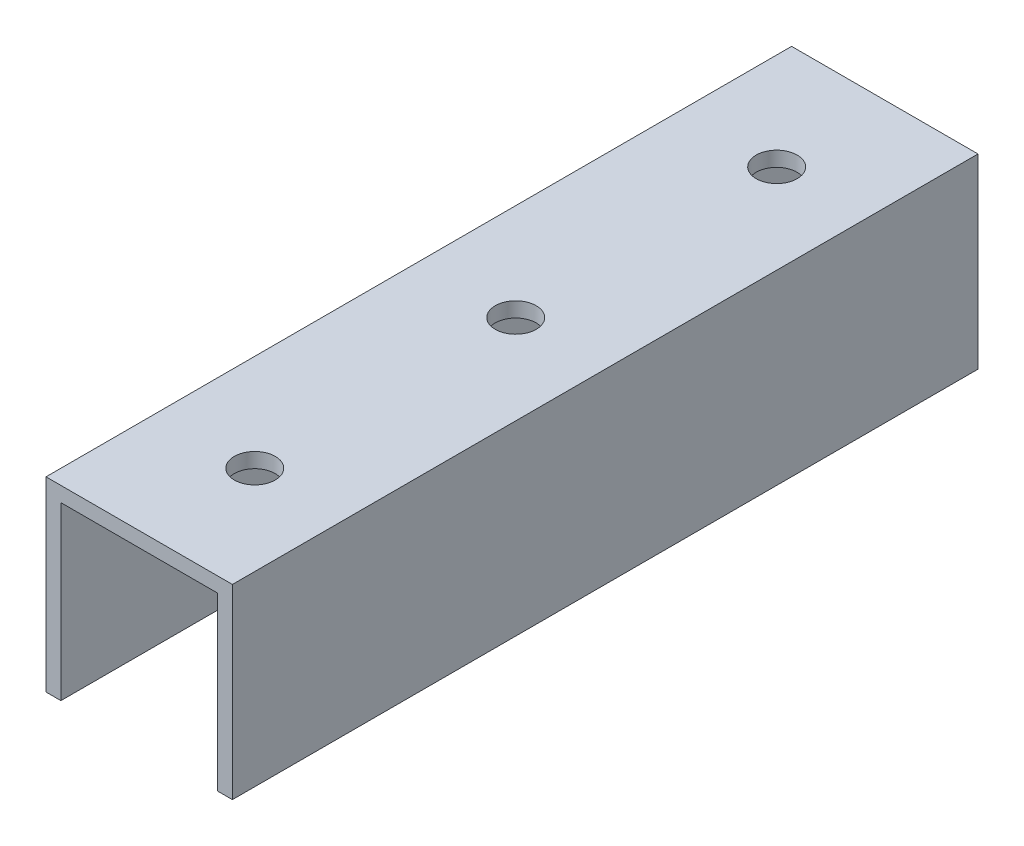
ISO-10303-21;
HEADER;
FILE_DESCRIPTION(('STEP AP214'),'2;1');
FILE_NAME('part.step','',(''),(''),'','','');
FILE_SCHEMA(('AUTOMOTIVE_DESIGN { 1 0 10303 214 1 1 1 1 }'));
ENDSEC;
DATA;
#1=APPLICATION_CONTEXT('core data for automotive mechanical design processes');
#2=APPLICATION_PROTOCOL_DEFINITION('international standard','automotive_design',2000,#1);
#3=PRODUCT_CONTEXT('',#1,'mechanical');
#4=PRODUCT('Part','Part','',(#3));
#5=PRODUCT_RELATED_PRODUCT_CATEGORY('part','',(#4));
#6=PRODUCT_DEFINITION_FORMATION('','',#4);
#7=PRODUCT_DEFINITION_CONTEXT('part definition',#1,'design');
#8=PRODUCT_DEFINITION('design','',#6,#7);
#9=PRODUCT_DEFINITION_SHAPE('','',#8);
#10=(LENGTH_UNIT() NAMED_UNIT(*) SI_UNIT(.MILLI.,.METRE.));
#11=(NAMED_UNIT(*) PLANE_ANGLE_UNIT() SI_UNIT($,.RADIAN.));
#12=(NAMED_UNIT(*) SI_UNIT($,.STERADIAN.) SOLID_ANGLE_UNIT());
#13=UNCERTAINTY_MEASURE_WITH_UNIT(LENGTH_MEASURE(1.E-05),#10,'distance_accuracy_value','');
#14=(GEOMETRIC_REPRESENTATION_CONTEXT(3) GLOBAL_UNCERTAINTY_ASSIGNED_CONTEXT((#13)) GLOBAL_UNIT_ASSIGNED_CONTEXT((#10,
#11,#12)) REPRESENTATION_CONTEXT('',''));
#15=CARTESIAN_POINT('',(0.,0.,0.));
#16=DIRECTION('',(0.,0.,1.));
#17=DIRECTION('',(1.,0.,0.));
#18=AXIS2_PLACEMENT_3D('',#15,#16,#17);
#19=CARTESIAN_POINT('',(2.,0.,100.));
#20=DIRECTION('',(0.,1.,0.));
#21=DIRECTION('',(-1.,0.,0.));
#22=AXIS2_PLACEMENT_3D('',#19,#20,#21);
#23=PLANE('',#22);
#24=DIRECTION('',(1.,0.,0.));
#25=VECTOR('',#24,1.);
#26=CARTESIAN_POINT('',(2.,0.,0.));
#27=LINE('',#26,#25);
#28=CARTESIAN_POINT('',(0.,0.,0.));
#29=VERTEX_POINT('',#28);
#30=CARTESIAN_POINT('',(2.,0.,0.));
#31=VERTEX_POINT('',#30);
#32=EDGE_CURVE('E130',#29,#31,#27,.T.);
#33=ORIENTED_EDGE('',*,*,#32,.T.);
#34=DIRECTION('',(0.,0.,-1.));
#35=VECTOR('',#34,1.);
#36=CARTESIAN_POINT('',(2.,0.,100.));
#37=LINE('',#36,#35);
#38=CARTESIAN_POINT('',(2.,0.,100.));
#39=VERTEX_POINT('',#38);
#40=EDGE_CURVE('E11',#39,#31,#37,.T.);
#41=ORIENTED_EDGE('',*,*,#40,.F.);
#42=DIRECTION('',(1.,0.,0.));
#43=VECTOR('',#42,1.);
#44=CARTESIAN_POINT('',(2.,0.,100.));
#45=LINE('',#44,#43);
#46=CARTESIAN_POINT('',(0.,0.,100.));
#47=VERTEX_POINT('',#46);
#48=EDGE_CURVE('E145',#47,#39,#45,.T.);
#49=ORIENTED_EDGE('',*,*,#48,.F.);
#50=DIRECTION('',(0.,0.,-1.));
#51=VECTOR('',#50,1.);
#52=CARTESIAN_POINT('',(0.,0.,100.));
#53=LINE('',#52,#51);
#54=EDGE_CURVE('E126',#47,#29,#53,.T.);
#55=ORIENTED_EDGE('',*,*,#54,.T.);
#56=EDGE_LOOP('',(#33,#41,#49,#55));
#57=FACE_BOUND('',#56,.T.);
#58=ADVANCED_FACE('F34',(#57),#23,.F.);
#59=CARTESIAN_POINT('',(2.,23.,100.));
#60=DIRECTION('',(-1.,0.,0.));
#61=DIRECTION('',(0.,-1.,0.));
#62=AXIS2_PLACEMENT_3D('',#59,#60,#61);
#63=PLANE('',#62);
#64=DIRECTION('',(0.,1.,0.));
#65=VECTOR('',#64,1.);
#66=CARTESIAN_POINT('',(2.,23.,0.));
#67=LINE('',#66,#65);
#68=CARTESIAN_POINT('',(2.,23.,0.));
#69=VERTEX_POINT('',#68);
#70=EDGE_CURVE('E133',#31,#69,#67,.T.);
#71=ORIENTED_EDGE('',*,*,#70,.T.);
#72=DIRECTION('',(0.,0.,-1.));
#73=VECTOR('',#72,1.);
#74=CARTESIAN_POINT('',(2.,23.,100.));
#75=LINE('',#74,#73);
#76=CARTESIAN_POINT('',(2.,23.,100.));
#77=VERTEX_POINT('',#76);
#78=EDGE_CURVE('E42',#77,#69,#75,.T.);
#79=ORIENTED_EDGE('',*,*,#78,.F.);
#80=DIRECTION('',(0.,1.,0.));
#81=VECTOR('',#80,1.);
#82=CARTESIAN_POINT('',(2.,23.,100.));
#83=LINE('',#82,#81);
#84=EDGE_CURVE('E93',#39,#77,#83,.T.);
#85=ORIENTED_EDGE('',*,*,#84,.F.);
#86=ORIENTED_EDGE('',*,*,#40,.T.);
#87=EDGE_LOOP('',(#71,#79,#85,#86));
#88=FACE_BOUND('',#87,.T.);
#89=ADVANCED_FACE('F215',(#88),#63,.F.);
#90=CARTESIAN_POINT('',(23.,23.,100.));
#91=DIRECTION('',(0.,1.,0.));
#92=DIRECTION('',(-1.,0.,0.));
#93=AXIS2_PLACEMENT_3D('',#90,#91,#92);
#94=PLANE('',#93);
#95=CARTESIAN_POINT('',(13.,23.,50.));
#96=DIRECTION('',(0.,1.,0.));
#97=DIRECTION('',(-1.,0.,0.));
#98=AXIS2_PLACEMENT_3D('',#95,#96,#97);
#99=CIRCLE('',#98,2.74999999999999);
#100=CARTESIAN_POINT('',(10.25,23.,50.));
#101=VERTEX_POINT('',#100);
#102=EDGE_CURVE('E189',#101,#101,#99,.T.);
#103=ORIENTED_EDGE('',*,*,#102,.T.);
#104=EDGE_LOOP('',(#103));
#105=FACE_BOUND('',#104,.T.);
#106=CARTESIAN_POINT('',(13.,23.,15.));
#107=DIRECTION('',(0.,1.,0.));
#108=DIRECTION('',(-1.,0.,0.));
#109=AXIS2_PLACEMENT_3D('',#106,#107,#108);
#110=CIRCLE('',#109,2.74999999999999);
#111=CARTESIAN_POINT('',(10.25,23.,15.));
#112=VERTEX_POINT('',#111);
#113=EDGE_CURVE('E183',#112,#112,#110,.T.);
#114=ORIENTED_EDGE('',*,*,#113,.T.);
#115=EDGE_LOOP('',(#114));
#116=FACE_BOUND('',#115,.T.);
#117=CARTESIAN_POINT('',(13.,23.,85.));
#118=DIRECTION('',(0.,1.,0.));
#119=DIRECTION('',(-1.,0.,0.));
#120=AXIS2_PLACEMENT_3D('',#117,#118,#119);
#121=CIRCLE('',#120,2.74999999999999);
#122=CARTESIAN_POINT('',(10.25,23.,85.));
#123=VERTEX_POINT('',#122);
#124=EDGE_CURVE('E134',#123,#123,#121,.T.);
#125=ORIENTED_EDGE('',*,*,#124,.T.);
#126=EDGE_LOOP('',(#125));
#127=FACE_BOUND('',#126,.T.);
#128=DIRECTION('',(1.,0.,0.));
#129=VECTOR('',#128,1.);
#130=CARTESIAN_POINT('',(23.,23.,0.));
#131=LINE('',#130,#129);
#132=CARTESIAN_POINT('',(23.,23.,0.));
#133=VERTEX_POINT('',#132);
#134=EDGE_CURVE('E136',#69,#133,#131,.T.);
#135=ORIENTED_EDGE('',*,*,#134,.T.);
#136=DIRECTION('',(0.,0.,-1.));
#137=VECTOR('',#136,1.);
#138=CARTESIAN_POINT('',(23.,23.,100.));
#139=LINE('',#138,#137);
#140=CARTESIAN_POINT('',(23.,23.,100.));
#141=VERTEX_POINT('',#140);
#142=EDGE_CURVE('E152',#141,#133,#139,.T.);
#143=ORIENTED_EDGE('',*,*,#142,.F.);
#144=DIRECTION('',(1.,0.,0.));
#145=VECTOR('',#144,1.);
#146=CARTESIAN_POINT('',(23.,23.,100.));
#147=LINE('',#146,#145);
#148=EDGE_CURVE('E160',#77,#141,#147,.T.);
#149=ORIENTED_EDGE('',*,*,#148,.F.);
#150=ORIENTED_EDGE('',*,*,#78,.T.);
#151=EDGE_LOOP('',(#135,#143,#149,#150));
#152=FACE_BOUND('',#151,.T.);
#153=ADVANCED_FACE('F158',(#105,#116,#127,#152),#94,.F.);
#154=CARTESIAN_POINT('',(23.,0.,100.));
#155=DIRECTION('',(1.,0.,0.));
#156=DIRECTION('',(0.,0.,-1.));
#157=AXIS2_PLACEMENT_3D('',#154,#155,#156);
#158=PLANE('',#157);
#159=DIRECTION('',(0.,-1.,0.));
#160=VECTOR('',#159,1.);
#161=CARTESIAN_POINT('',(23.,0.,0.));
#162=LINE('',#161,#160);
#163=CARTESIAN_POINT('',(23.,0.,0.));
#164=VERTEX_POINT('',#163);
#165=EDGE_CURVE('E138',#133,#164,#162,.T.);
#166=ORIENTED_EDGE('',*,*,#165,.T.);
#167=DIRECTION('',(0.,0.,-1.));
#168=VECTOR('',#167,1.);
#169=CARTESIAN_POINT('',(23.,0.,100.));
#170=LINE('',#169,#168);
#171=CARTESIAN_POINT('',(23.,0.,100.));
#172=VERTEX_POINT('',#171);
#173=EDGE_CURVE('E149',#172,#164,#170,.T.);
#174=ORIENTED_EDGE('',*,*,#173,.F.);
#175=DIRECTION('',(0.,-1.,0.));
#176=VECTOR('',#175,1.);
#177=CARTESIAN_POINT('',(23.,0.,100.));
#178=LINE('',#177,#176);
#179=EDGE_CURVE('E172',#141,#172,#178,.T.);
#180=ORIENTED_EDGE('',*,*,#179,.F.);
#181=ORIENTED_EDGE('',*,*,#142,.T.);
#182=EDGE_LOOP('',(#166,#174,#180,#181));
#183=FACE_BOUND('',#182,.T.);
#184=ADVANCED_FACE('F168',(#183),#158,.F.);
#185=CARTESIAN_POINT('',(25.,0.,100.));
#186=DIRECTION('',(0.,1.,0.));
#187=DIRECTION('',(-1.,0.,0.));
#188=AXIS2_PLACEMENT_3D('',#185,#186,#187);
#189=PLANE('',#188);
#190=DIRECTION('',(1.,0.,0.));
#191=VECTOR('',#190,1.);
#192=CARTESIAN_POINT('',(25.,0.,0.));
#193=LINE('',#192,#191);
#194=CARTESIAN_POINT('',(25.,0.,0.));
#195=VERTEX_POINT('',#194);
#196=EDGE_CURVE('E140',#164,#195,#193,.T.);
#197=ORIENTED_EDGE('',*,*,#196,.T.);
#198=DIRECTION('',(0.,0.,-1.));
#199=VECTOR('',#198,1.);
#200=CARTESIAN_POINT('',(25.,0.,100.));
#201=LINE('',#200,#199);
#202=CARTESIAN_POINT('',(25.,0.,100.));
#203=VERTEX_POINT('',#202);
#204=EDGE_CURVE('E121',#203,#195,#201,.T.);
#205=ORIENTED_EDGE('',*,*,#204,.F.);
#206=DIRECTION('',(1.,0.,0.));
#207=VECTOR('',#206,1.);
#208=CARTESIAN_POINT('',(25.,0.,100.));
#209=LINE('',#208,#207);
#210=EDGE_CURVE('E112',#172,#203,#209,.T.);
#211=ORIENTED_EDGE('',*,*,#210,.F.);
#212=ORIENTED_EDGE('',*,*,#173,.T.);
#213=EDGE_LOOP('',(#197,#205,#211,#212));
#214=FACE_BOUND('',#213,.T.);
#215=ADVANCED_FACE('F171',(#214),#189,.F.);
#216=CARTESIAN_POINT('',(25.,25.,100.));
#217=DIRECTION('',(-1.,0.,0.));
#218=DIRECTION('',(0.,-1.,0.));
#219=AXIS2_PLACEMENT_3D('',#216,#217,#218);
#220=PLANE('',#219);
#221=DIRECTION('',(0.,1.,0.));
#222=VECTOR('',#221,1.);
#223=CARTESIAN_POINT('',(25.,25.,0.));
#224=LINE('',#223,#222);
#225=CARTESIAN_POINT('',(25.,25.,0.));
#226=VERTEX_POINT('',#225);
#227=EDGE_CURVE('E120',#195,#226,#224,.T.);
#228=ORIENTED_EDGE('',*,*,#227,.T.);
#229=DIRECTION('',(0.,0.,-1.));
#230=VECTOR('',#229,1.);
#231=CARTESIAN_POINT('',(25.,25.,100.));
#232=LINE('',#231,#230);
#233=CARTESIAN_POINT('',(25.,25.,100.));
#234=VERTEX_POINT('',#233);
#235=EDGE_CURVE('E117',#234,#226,#232,.T.);
#236=ORIENTED_EDGE('',*,*,#235,.F.);
#237=DIRECTION('',(0.,1.,0.));
#238=VECTOR('',#237,1.);
#239=CARTESIAN_POINT('',(25.,25.,100.));
#240=LINE('',#239,#238);
#241=EDGE_CURVE('E106',#203,#234,#240,.T.);
#242=ORIENTED_EDGE('',*,*,#241,.F.);
#243=ORIENTED_EDGE('',*,*,#204,.T.);
#244=EDGE_LOOP('',(#228,#236,#242,#243));
#245=FACE_BOUND('',#244,.T.);
#246=ADVANCED_FACE('F118',(#245),#220,.F.);
#247=CARTESIAN_POINT('',(0.,25.,100.));
#248=DIRECTION('',(0.,-1.,0.));
#249=DIRECTION('',(0.,0.,-1.));
#250=AXIS2_PLACEMENT_3D('',#247,#248,#249);
#251=PLANE('',#250);
#252=CARTESIAN_POINT('',(13.,25.,50.));
#253=DIRECTION('',(0.,1.,0.));
#254=DIRECTION('',(0.,0.,1.));
#255=AXIS2_PLACEMENT_3D('',#252,#253,#254);
#256=CIRCLE('',#255,2.74999999999999);
#257=CARTESIAN_POINT('',(13.,25.,52.75));
#258=VERTEX_POINT('',#257);
#259=EDGE_CURVE('E192',#258,#258,#256,.T.);
#260=ORIENTED_EDGE('',*,*,#259,.F.);
#261=EDGE_LOOP('',(#260));
#262=FACE_BOUND('',#261,.T.);
#263=CARTESIAN_POINT('',(13.,25.,15.));
#264=DIRECTION('',(0.,1.,0.));
#265=DIRECTION('',(0.,0.,1.));
#266=AXIS2_PLACEMENT_3D('',#263,#264,#265);
#267=CIRCLE('',#266,2.74999999999999);
#268=CARTESIAN_POINT('',(13.,25.,17.75));
#269=VERTEX_POINT('',#268);
#270=EDGE_CURVE('E186',#269,#269,#267,.T.);
#271=ORIENTED_EDGE('',*,*,#270,.F.);
#272=EDGE_LOOP('',(#271));
#273=FACE_BOUND('',#272,.T.);
#274=CARTESIAN_POINT('',(13.,25.,85.));
#275=DIRECTION('',(0.,1.,0.));
#276=DIRECTION('',(0.,0.,1.));
#277=AXIS2_PLACEMENT_3D('',#274,#275,#276);
#278=CIRCLE('',#277,2.74999999999999);
#279=CARTESIAN_POINT('',(13.,25.,87.75));
#280=VERTEX_POINT('',#279);
#281=EDGE_CURVE('E180',#280,#280,#278,.T.);
#282=ORIENTED_EDGE('',*,*,#281,.F.);
#283=EDGE_LOOP('',(#282));
#284=FACE_BOUND('',#283,.T.);
#285=DIRECTION('',(-1.,0.,0.));
#286=VECTOR('',#285,1.);
#287=CARTESIAN_POINT('',(0.,25.,0.));
#288=LINE('',#287,#286);
#289=CARTESIAN_POINT('',(0.,25.,0.));
#290=VERTEX_POINT('',#289);
#291=EDGE_CURVE('E79',#226,#290,#288,.T.);
#292=ORIENTED_EDGE('',*,*,#291,.T.);
#293=DIRECTION('',(0.,0.,-1.));
#294=VECTOR('',#293,1.);
#295=CARTESIAN_POINT('',(0.,25.,100.));
#296=LINE('',#295,#294);
#297=CARTESIAN_POINT('',(0.,25.,100.));
#298=VERTEX_POINT('',#297);
#299=EDGE_CURVE('E122',#298,#290,#296,.T.);
#300=ORIENTED_EDGE('',*,*,#299,.F.);
#301=DIRECTION('',(-1.,0.,0.));
#302=VECTOR('',#301,1.);
#303=CARTESIAN_POINT('',(0.,25.,100.));
#304=LINE('',#303,#302);
#305=EDGE_CURVE('E110',#234,#298,#304,.T.);
#306=ORIENTED_EDGE('',*,*,#305,.F.);
#307=ORIENTED_EDGE('',*,*,#235,.T.);
#308=EDGE_LOOP('',(#292,#300,#306,#307));
#309=FACE_BOUND('',#308,.T.);
#310=ADVANCED_FACE('F124',(#262,#273,#284,#309),#251,.F.);
#311=CARTESIAN_POINT('',(0.,0.,100.));
#312=DIRECTION('',(1.,0.,0.));
#313=DIRECTION('',(0.,0.,-1.));
#314=AXIS2_PLACEMENT_3D('',#311,#312,#313);
#315=PLANE('',#314);
#316=DIRECTION('',(0.,-1.,0.));
#317=VECTOR('',#316,1.);
#318=CARTESIAN_POINT('',(0.,0.,0.));
#319=LINE('',#318,#317);
#320=EDGE_CURVE('E85',#290,#29,#319,.T.);
#321=ORIENTED_EDGE('',*,*,#320,.T.);
#322=ORIENTED_EDGE('',*,*,#54,.F.);
#323=DIRECTION('',(0.,-1.,0.));
#324=VECTOR('',#323,1.);
#325=CARTESIAN_POINT('',(0.,0.,100.));
#326=LINE('',#325,#324);
#327=EDGE_CURVE('E50',#298,#47,#326,.T.);
#328=ORIENTED_EDGE('',*,*,#327,.F.);
#329=ORIENTED_EDGE('',*,*,#299,.T.);
#330=EDGE_LOOP('',(#321,#322,#328,#329));
#331=FACE_BOUND('',#330,.T.);
#332=ADVANCED_FACE('F201',(#331),#315,.F.);
#333=CARTESIAN_POINT('',(0.,0.,100.));
#334=DIRECTION('',(0.,0.,-1.));
#335=DIRECTION('',(-1.,0.,0.));
#336=AXIS2_PLACEMENT_3D('',#333,#334,#335);
#337=PLANE('',#336);
#338=ORIENTED_EDGE('',*,*,#48,.T.);
#339=ORIENTED_EDGE('',*,*,#84,.T.);
#340=ORIENTED_EDGE('',*,*,#148,.T.);
#341=ORIENTED_EDGE('',*,*,#179,.T.);
#342=ORIENTED_EDGE('',*,*,#210,.T.);
#343=ORIENTED_EDGE('',*,*,#241,.T.);
#344=ORIENTED_EDGE('',*,*,#305,.T.);
#345=ORIENTED_EDGE('',*,*,#327,.T.);
#346=EDGE_LOOP('',(#338,#339,#340,#341,#342,#343,#344,#345));
#347=FACE_BOUND('',#346,.T.);
#348=ADVANCED_FACE('F108',(#347),#337,.F.);
#349=CARTESIAN_POINT('',(0.,0.,0.));
#350=DIRECTION('',(0.,0.,-1.));
#351=DIRECTION('',(-1.,0.,0.));
#352=AXIS2_PLACEMENT_3D('',#349,#350,#351);
#353=PLANE('',#352);
#354=ORIENTED_EDGE('',*,*,#32,.F.);
#355=ORIENTED_EDGE('',*,*,#320,.F.);
#356=ORIENTED_EDGE('',*,*,#291,.F.);
#357=ORIENTED_EDGE('',*,*,#227,.F.);
#358=ORIENTED_EDGE('',*,*,#196,.F.);
#359=ORIENTED_EDGE('',*,*,#165,.F.);
#360=ORIENTED_EDGE('',*,*,#134,.F.);
#361=ORIENTED_EDGE('',*,*,#70,.F.);
#362=EDGE_LOOP('',(#354,#355,#356,#357,#358,#359,#360,#361));
#363=FACE_BOUND('',#362,.T.);
#364=ADVANCED_FACE('F164',(#363),#353,.T.);
#365=CARTESIAN_POINT('',(13.,25.,85.));
#366=DIRECTION('',(0.,1.,0.));
#367=DIRECTION('',(0.,0.,1.));
#368=AXIS2_PLACEMENT_3D('',#365,#366,#367);
#369=CYLINDRICAL_SURFACE('',#368,2.74999999999999);
#370=ORIENTED_EDGE('',*,*,#281,.T.);
#371=EDGE_LOOP('',(#370));
#372=FACE_BOUND('',#371,.T.);
#373=ORIENTED_EDGE('',*,*,#124,.F.);
#374=EDGE_LOOP('',(#373));
#375=FACE_BOUND('',#374,.T.);
#376=ADVANCED_FACE('F207',(#372,#375),#369,.F.);
#377=CARTESIAN_POINT('',(13.,25.,15.));
#378=DIRECTION('',(0.,1.,0.));
#379=DIRECTION('',(0.,0.,1.));
#380=AXIS2_PLACEMENT_3D('',#377,#378,#379);
#381=CYLINDRICAL_SURFACE('',#380,2.74999999999999);
#382=ORIENTED_EDGE('',*,*,#270,.T.);
#383=EDGE_LOOP('',(#382));
#384=FACE_BOUND('',#383,.T.);
#385=ORIENTED_EDGE('',*,*,#113,.F.);
#386=EDGE_LOOP('',(#385));
#387=FACE_BOUND('',#386,.T.);
#388=ADVANCED_FACE('F210',(#384,#387),#381,.F.);
#389=CARTESIAN_POINT('',(13.,25.,50.));
#390=DIRECTION('',(0.,1.,0.));
#391=DIRECTION('',(0.,0.,1.));
#392=AXIS2_PLACEMENT_3D('',#389,#390,#391);
#393=CYLINDRICAL_SURFACE('',#392,2.74999999999999);
#394=ORIENTED_EDGE('',*,*,#259,.T.);
#395=EDGE_LOOP('',(#394));
#396=FACE_BOUND('',#395,.T.);
#397=ORIENTED_EDGE('',*,*,#102,.F.);
#398=EDGE_LOOP('',(#397));
#399=FACE_BOUND('',#398,.T.);
#400=ADVANCED_FACE('F196',(#396,#399),#393,.F.);
#401=CLOSED_SHELL('',(#58,#89,#153,#184,#215,#246,#310,#332,#348,#364,#376,#388,#400));
#402=MANIFOLD_SOLID_BREP('B2',#401);
#403=ADVANCED_BREP_SHAPE_REPRESENTATION('',(#18,#402),#14);
#404=SHAPE_DEFINITION_REPRESENTATION(#9,#403);
ENDSEC;
END-ISO-10303-21;
